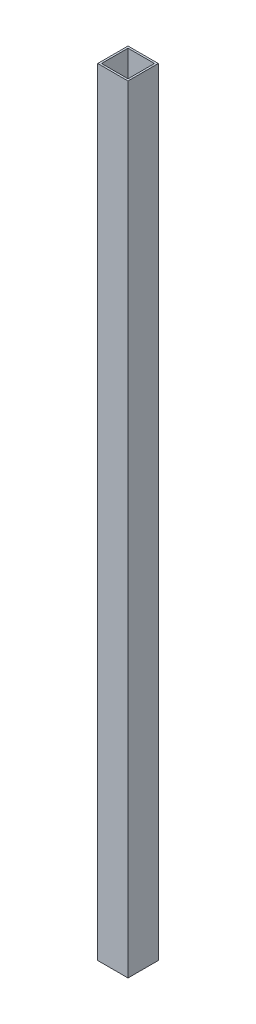
ISO-10303-21;
HEADER;
FILE_DESCRIPTION(('STEP AP214'),'2;1');
FILE_NAME('part.step','',(''),(''),'','','');
FILE_SCHEMA(('AUTOMOTIVE_DESIGN { 1 0 10303 214 1 1 1 1 }'));
ENDSEC;
DATA;
#1=APPLICATION_CONTEXT('core data for automotive mechanical design processes');
#2=APPLICATION_PROTOCOL_DEFINITION('international standard','automotive_design',2000,#1);
#3=PRODUCT_CONTEXT('',#1,'mechanical');
#4=PRODUCT('Part','Part','',(#3));
#5=PRODUCT_RELATED_PRODUCT_CATEGORY('part','',(#4));
#6=PRODUCT_DEFINITION_FORMATION('','',#4);
#7=PRODUCT_DEFINITION_CONTEXT('part definition',#1,'design');
#8=PRODUCT_DEFINITION('design','',#6,#7);
#9=PRODUCT_DEFINITION_SHAPE('','',#8);
#10=(LENGTH_UNIT() NAMED_UNIT(*) SI_UNIT(.MILLI.,.METRE.));
#11=(NAMED_UNIT(*) PLANE_ANGLE_UNIT() SI_UNIT($,.RADIAN.));
#12=(NAMED_UNIT(*) SI_UNIT($,.STERADIAN.) SOLID_ANGLE_UNIT());
#13=UNCERTAINTY_MEASURE_WITH_UNIT(LENGTH_MEASURE(1.E-05),#10,'distance_accuracy_value','');
#14=(GEOMETRIC_REPRESENTATION_CONTEXT(3) GLOBAL_UNCERTAINTY_ASSIGNED_CONTEXT((#13)) GLOBAL_UNIT_ASSIGNED_CONTEXT((#10,
#11,#12)) REPRESENTATION_CONTEXT('',''));
#15=CARTESIAN_POINT('',(0.,0.,0.));
#16=DIRECTION('',(0.,0.,1.));
#17=DIRECTION('',(1.,0.,0.));
#18=AXIS2_PLACEMENT_3D('',#15,#16,#17);
#19=CARTESIAN_POINT('',(0.,1303.57,0.));
#20=DIRECTION('',(0.,1.,0.));
#21=DIRECTION('',(0.,0.,1.));
#22=AXIS2_PLACEMENT_3D('',#19,#20,#21);
#23=PLANE('',#22);
#24=DIRECTION('',(0.,0.,-1.));
#25=VECTOR('',#24,1.);
#26=CARTESIAN_POINT('',(25.4,1303.57,-25.4));
#27=LINE('',#26,#25);
#28=CARTESIAN_POINT('',(25.4,1303.57,25.4));
#29=VERTEX_POINT('',#28);
#30=CARTESIAN_POINT('',(25.4,1303.57,-25.4));
#31=VERTEX_POINT('',#30);
#32=EDGE_CURVE('E153',#29,#31,#27,.T.);
#33=ORIENTED_EDGE('',*,*,#32,.T.);
#34=DIRECTION('',(-1.,0.,0.));
#35=VECTOR('',#34,1.);
#36=CARTESIAN_POINT('',(-25.4,1303.57,-25.4));
#37=LINE('',#36,#35);
#38=CARTESIAN_POINT('',(-25.4,1303.57,-25.4));
#39=VERTEX_POINT('',#38);
#40=EDGE_CURVE('E157',#31,#39,#37,.T.);
#41=ORIENTED_EDGE('',*,*,#40,.T.);
#42=DIRECTION('',(0.,0.,1.));
#43=VECTOR('',#42,1.);
#44=CARTESIAN_POINT('',(-25.4,1303.57,-25.4));
#45=LINE('',#44,#43);
#46=CARTESIAN_POINT('',(-25.4,1303.57,25.4));
#47=VERTEX_POINT('',#46);
#48=EDGE_CURVE('E161',#39,#47,#45,.T.);
#49=ORIENTED_EDGE('',*,*,#48,.T.);
#50=DIRECTION('',(1.,0.,0.));
#51=VECTOR('',#50,1.);
#52=CARTESIAN_POINT('',(-25.4,1303.57,25.4));
#53=LINE('',#52,#51);
#54=EDGE_CURVE('E164',#47,#29,#53,.T.);
#55=ORIENTED_EDGE('',*,*,#54,.T.);
#56=EDGE_LOOP('',(#33,#41,#49,#55));
#57=FACE_BOUND('',#56,.T.);
#58=DIRECTION('',(-1.,0.,0.));
#59=VECTOR('',#58,1.);
#60=CARTESIAN_POINT('',(-22.225,1303.57,-22.225));
#61=LINE('',#60,#59);
#62=CARTESIAN_POINT('',(22.225,1303.57,-22.225));
#63=VERTEX_POINT('',#62);
#64=CARTESIAN_POINT('',(-22.225,1303.57,-22.225));
#65=VERTEX_POINT('',#64);
#66=EDGE_CURVE('E114',#63,#65,#61,.T.);
#67=ORIENTED_EDGE('',*,*,#66,.F.);
#68=DIRECTION('',(0.,0.,-1.));
#69=VECTOR('',#68,1.);
#70=CARTESIAN_POINT('',(22.225,1303.57,-22.225));
#71=LINE('',#70,#69);
#72=CARTESIAN_POINT('',(22.225,1303.57,22.225));
#73=VERTEX_POINT('',#72);
#74=EDGE_CURVE('E105',#73,#63,#71,.T.);
#75=ORIENTED_EDGE('',*,*,#74,.F.);
#76=DIRECTION('',(1.,0.,0.));
#77=VECTOR('',#76,1.);
#78=CARTESIAN_POINT('',(-22.225,1303.57,22.225));
#79=LINE('',#78,#77);
#80=CARTESIAN_POINT('',(-22.225,1303.57,22.225));
#81=VERTEX_POINT('',#80);
#82=EDGE_CURVE('E131',#81,#73,#79,.T.);
#83=ORIENTED_EDGE('',*,*,#82,.F.);
#84=DIRECTION('',(0.,0.,1.));
#85=VECTOR('',#84,1.);
#86=CARTESIAN_POINT('',(-22.225,1303.57,-22.225));
#87=LINE('',#86,#85);
#88=EDGE_CURVE('E127',#65,#81,#87,.T.);
#89=ORIENTED_EDGE('',*,*,#88,.F.);
#90=EDGE_LOOP('',(#67,#75,#83,#89));
#91=FACE_BOUND('',#90,.T.);
#92=ADVANCED_FACE('F39',(#57,#91),#23,.T.);
#93=CARTESIAN_POINT('',(0.,0.,0.));
#94=DIRECTION('',(0.,1.,0.));
#95=DIRECTION('',(0.,0.,1.));
#96=AXIS2_PLACEMENT_3D('',#93,#94,#95);
#97=PLANE('',#96);
#98=DIRECTION('',(0.,0.,-1.));
#99=VECTOR('',#98,1.);
#100=CARTESIAN_POINT('',(25.4,0.,-25.4));
#101=LINE('',#100,#99);
#102=CARTESIAN_POINT('',(25.4,0.,25.4));
#103=VERTEX_POINT('',#102);
#104=CARTESIAN_POINT('',(25.4,0.,-25.4));
#105=VERTEX_POINT('',#104);
#106=EDGE_CURVE('E123',#103,#105,#101,.T.);
#107=ORIENTED_EDGE('',*,*,#106,.F.);
#108=DIRECTION('',(1.,0.,0.));
#109=VECTOR('',#108,1.);
#110=CARTESIAN_POINT('',(-25.4,0.,25.4));
#111=LINE('',#110,#109);
#112=CARTESIAN_POINT('',(-25.4,0.,25.4));
#113=VERTEX_POINT('',#112);
#114=EDGE_CURVE('E158',#113,#103,#111,.T.);
#115=ORIENTED_EDGE('',*,*,#114,.F.);
#116=DIRECTION('',(0.,0.,1.));
#117=VECTOR('',#116,1.);
#118=CARTESIAN_POINT('',(-25.4,0.,-25.4));
#119=LINE('',#118,#117);
#120=CARTESIAN_POINT('',(-25.4,0.,-25.4));
#121=VERTEX_POINT('',#120);
#122=EDGE_CURVE('E174',#121,#113,#119,.T.);
#123=ORIENTED_EDGE('',*,*,#122,.F.);
#124=DIRECTION('',(-1.,0.,0.));
#125=VECTOR('',#124,1.);
#126=CARTESIAN_POINT('',(-25.4,0.,-25.4));
#127=LINE('',#126,#125);
#128=EDGE_CURVE('E171',#105,#121,#127,.T.);
#129=ORIENTED_EDGE('',*,*,#128,.F.);
#130=EDGE_LOOP('',(#107,#115,#123,#129));
#131=FACE_BOUND('',#130,.T.);
#132=DIRECTION('',(0.,0.,-1.));
#133=VECTOR('',#132,1.);
#134=CARTESIAN_POINT('',(22.225,0.,-22.225));
#135=LINE('',#134,#133);
#136=CARTESIAN_POINT('',(22.225,0.,22.225));
#137=VERTEX_POINT('',#136);
#138=CARTESIAN_POINT('',(22.225,0.,-22.225));
#139=VERTEX_POINT('',#138);
#140=EDGE_CURVE('E63',#137,#139,#135,.T.);
#141=ORIENTED_EDGE('',*,*,#140,.T.);
#142=DIRECTION('',(-1.,0.,0.));
#143=VECTOR('',#142,1.);
#144=CARTESIAN_POINT('',(-22.225,0.,-22.225));
#145=LINE('',#144,#143);
#146=CARTESIAN_POINT('',(-22.225,0.,-22.225));
#147=VERTEX_POINT('',#146);
#148=EDGE_CURVE('E121',#139,#147,#145,.T.);
#149=ORIENTED_EDGE('',*,*,#148,.T.);
#150=DIRECTION('',(0.,0.,1.));
#151=VECTOR('',#150,1.);
#152=CARTESIAN_POINT('',(-22.225,0.,-22.225));
#153=LINE('',#152,#151);
#154=CARTESIAN_POINT('',(-22.225,0.,22.225));
#155=VERTEX_POINT('',#154);
#156=EDGE_CURVE('E140',#147,#155,#153,.T.);
#157=ORIENTED_EDGE('',*,*,#156,.T.);
#158=DIRECTION('',(1.,0.,0.));
#159=VECTOR('',#158,1.);
#160=CARTESIAN_POINT('',(-22.225,0.,22.225));
#161=LINE('',#160,#159);
#162=EDGE_CURVE('E115',#155,#137,#161,.T.);
#163=ORIENTED_EDGE('',*,*,#162,.T.);
#164=EDGE_LOOP('',(#141,#149,#157,#163));
#165=FACE_BOUND('',#164,.T.);
#166=ADVANCED_FACE('F197',(#131,#165),#97,.F.);
#167=CARTESIAN_POINT('',(25.4,1303.57,-25.4));
#168=DIRECTION('',(-1.,0.,0.));
#169=DIRECTION('',(0.,0.,1.));
#170=AXIS2_PLACEMENT_3D('',#167,#168,#169);
#171=PLANE('',#170);
#172=ORIENTED_EDGE('',*,*,#106,.T.);
#173=DIRECTION('',(0.,-1.,0.));
#174=VECTOR('',#173,1.);
#175=CARTESIAN_POINT('',(25.4,1303.57,-25.4));
#176=LINE('',#175,#174);
#177=EDGE_CURVE('E11',#31,#105,#176,.T.);
#178=ORIENTED_EDGE('',*,*,#177,.F.);
#179=ORIENTED_EDGE('',*,*,#32,.F.);
#180=DIRECTION('',(0.,-1.,0.));
#181=VECTOR('',#180,1.);
#182=CARTESIAN_POINT('',(25.4,1303.57,25.4));
#183=LINE('',#182,#181);
#184=EDGE_CURVE('E167',#29,#103,#183,.T.);
#185=ORIENTED_EDGE('',*,*,#184,.T.);
#186=EDGE_LOOP('',(#172,#178,#179,#185));
#187=FACE_BOUND('',#186,.T.);
#188=ADVANCED_FACE('F41',(#187),#171,.F.);
#189=CARTESIAN_POINT('',(-25.4,1303.57,-25.4));
#190=DIRECTION('',(0.,0.,1.));
#191=DIRECTION('',(1.,0.,0.));
#192=AXIS2_PLACEMENT_3D('',#189,#190,#191);
#193=PLANE('',#192);
#194=ORIENTED_EDGE('',*,*,#128,.T.);
#195=DIRECTION('',(0.,-1.,0.));
#196=VECTOR('',#195,1.);
#197=CARTESIAN_POINT('',(-25.4,1303.57,-25.4));
#198=LINE('',#197,#196);
#199=EDGE_CURVE('E48',#39,#121,#198,.T.);
#200=ORIENTED_EDGE('',*,*,#199,.F.);
#201=ORIENTED_EDGE('',*,*,#40,.F.);
#202=ORIENTED_EDGE('',*,*,#177,.T.);
#203=EDGE_LOOP('',(#194,#200,#201,#202));
#204=FACE_BOUND('',#203,.T.);
#205=ADVANCED_FACE('F207',(#204),#193,.F.);
#206=CARTESIAN_POINT('',(-25.4,1303.57,-25.4));
#207=DIRECTION('',(1.,0.,0.));
#208=DIRECTION('',(0.,0.,-1.));
#209=AXIS2_PLACEMENT_3D('',#206,#207,#208);
#210=PLANE('',#209);
#211=ORIENTED_EDGE('',*,*,#122,.T.);
#212=DIRECTION('',(0.,-1.,0.));
#213=VECTOR('',#212,1.);
#214=CARTESIAN_POINT('',(-25.4,1303.57,25.4));
#215=LINE('',#214,#213);
#216=EDGE_CURVE('E182',#47,#113,#215,.T.);
#217=ORIENTED_EDGE('',*,*,#216,.F.);
#218=ORIENTED_EDGE('',*,*,#48,.F.);
#219=ORIENTED_EDGE('',*,*,#199,.T.);
#220=EDGE_LOOP('',(#211,#217,#218,#219));
#221=FACE_BOUND('',#220,.T.);
#222=ADVANCED_FACE('F191',(#221),#210,.F.);
#223=CARTESIAN_POINT('',(-25.4,1303.57,25.4));
#224=DIRECTION('',(0.,0.,-1.));
#225=DIRECTION('',(-1.,0.,0.));
#226=AXIS2_PLACEMENT_3D('',#223,#224,#225);
#227=PLANE('',#226);
#228=ORIENTED_EDGE('',*,*,#114,.T.);
#229=ORIENTED_EDGE('',*,*,#184,.F.);
#230=ORIENTED_EDGE('',*,*,#54,.F.);
#231=ORIENTED_EDGE('',*,*,#216,.T.);
#232=EDGE_LOOP('',(#228,#229,#230,#231));
#233=FACE_BOUND('',#232,.T.);
#234=ADVANCED_FACE('F201',(#233),#227,.F.);
#235=CARTESIAN_POINT('',(22.225,1303.57,-22.225));
#236=DIRECTION('',(-1.,0.,0.));
#237=DIRECTION('',(0.,0.,1.));
#238=AXIS2_PLACEMENT_3D('',#235,#236,#237);
#239=PLANE('',#238);
#240=ORIENTED_EDGE('',*,*,#140,.F.);
#241=DIRECTION('',(0.,-1.,0.));
#242=VECTOR('',#241,1.);
#243=CARTESIAN_POINT('',(22.225,1303.57,22.225));
#244=LINE('',#243,#242);
#245=EDGE_CURVE('E109',#73,#137,#244,.T.);
#246=ORIENTED_EDGE('',*,*,#245,.F.);
#247=ORIENTED_EDGE('',*,*,#74,.T.);
#248=DIRECTION('',(0.,-1.,0.));
#249=VECTOR('',#248,1.);
#250=CARTESIAN_POINT('',(22.225,1303.57,-22.225));
#251=LINE('',#250,#249);
#252=EDGE_CURVE('E108',#63,#139,#251,.T.);
#253=ORIENTED_EDGE('',*,*,#252,.T.);
#254=EDGE_LOOP('',(#240,#246,#247,#253));
#255=FACE_BOUND('',#254,.T.);
#256=ADVANCED_FACE('F107',(#255),#239,.T.);
#257=CARTESIAN_POINT('',(-22.225,1303.57,-22.225));
#258=DIRECTION('',(0.,0.,1.));
#259=DIRECTION('',(1.,0.,0.));
#260=AXIS2_PLACEMENT_3D('',#257,#258,#259);
#261=PLANE('',#260);
#262=ORIENTED_EDGE('',*,*,#148,.F.);
#263=ORIENTED_EDGE('',*,*,#252,.F.);
#264=ORIENTED_EDGE('',*,*,#66,.T.);
#265=DIRECTION('',(0.,-1.,0.));
#266=VECTOR('',#265,1.);
#267=CARTESIAN_POINT('',(-22.225,1303.57,-22.225));
#268=LINE('',#267,#266);
#269=EDGE_CURVE('E124',#65,#147,#268,.T.);
#270=ORIENTED_EDGE('',*,*,#269,.T.);
#271=EDGE_LOOP('',(#262,#263,#264,#270));
#272=FACE_BOUND('',#271,.T.);
#273=ADVANCED_FACE('F118',(#272),#261,.T.);
#274=CARTESIAN_POINT('',(-22.225,1303.57,-22.225));
#275=DIRECTION('',(1.,0.,0.));
#276=DIRECTION('',(0.,0.,-1.));
#277=AXIS2_PLACEMENT_3D('',#274,#275,#276);
#278=PLANE('',#277);
#279=ORIENTED_EDGE('',*,*,#156,.F.);
#280=ORIENTED_EDGE('',*,*,#269,.F.);
#281=ORIENTED_EDGE('',*,*,#88,.T.);
#282=DIRECTION('',(0.,-1.,0.));
#283=VECTOR('',#282,1.);
#284=CARTESIAN_POINT('',(-22.225,1303.57,22.225));
#285=LINE('',#284,#283);
#286=EDGE_CURVE('E55',#81,#155,#285,.T.);
#287=ORIENTED_EDGE('',*,*,#286,.T.);
#288=EDGE_LOOP('',(#279,#280,#281,#287));
#289=FACE_BOUND('',#288,.T.);
#290=ADVANCED_FACE('F230',(#289),#278,.T.);
#291=CARTESIAN_POINT('',(-22.225,1303.57,22.225));
#292=DIRECTION('',(0.,0.,-1.));
#293=DIRECTION('',(-1.,0.,0.));
#294=AXIS2_PLACEMENT_3D('',#291,#292,#293);
#295=PLANE('',#294);
#296=ORIENTED_EDGE('',*,*,#162,.F.);
#297=ORIENTED_EDGE('',*,*,#286,.F.);
#298=ORIENTED_EDGE('',*,*,#82,.T.);
#299=ORIENTED_EDGE('',*,*,#245,.T.);
#300=EDGE_LOOP('',(#296,#297,#298,#299));
#301=FACE_BOUND('',#300,.T.);
#302=ADVANCED_FACE('F234',(#301),#295,.T.);
#303=CLOSED_SHELL('',(#92,#166,#188,#205,#222,#234,#256,#273,#290,#302));
#304=MANIFOLD_SOLID_BREP('B2',#303);
#305=ADVANCED_BREP_SHAPE_REPRESENTATION('',(#18,#304),#14);
#306=SHAPE_DEFINITION_REPRESENTATION(#9,#305);
ENDSEC;
END-ISO-10303-21;
